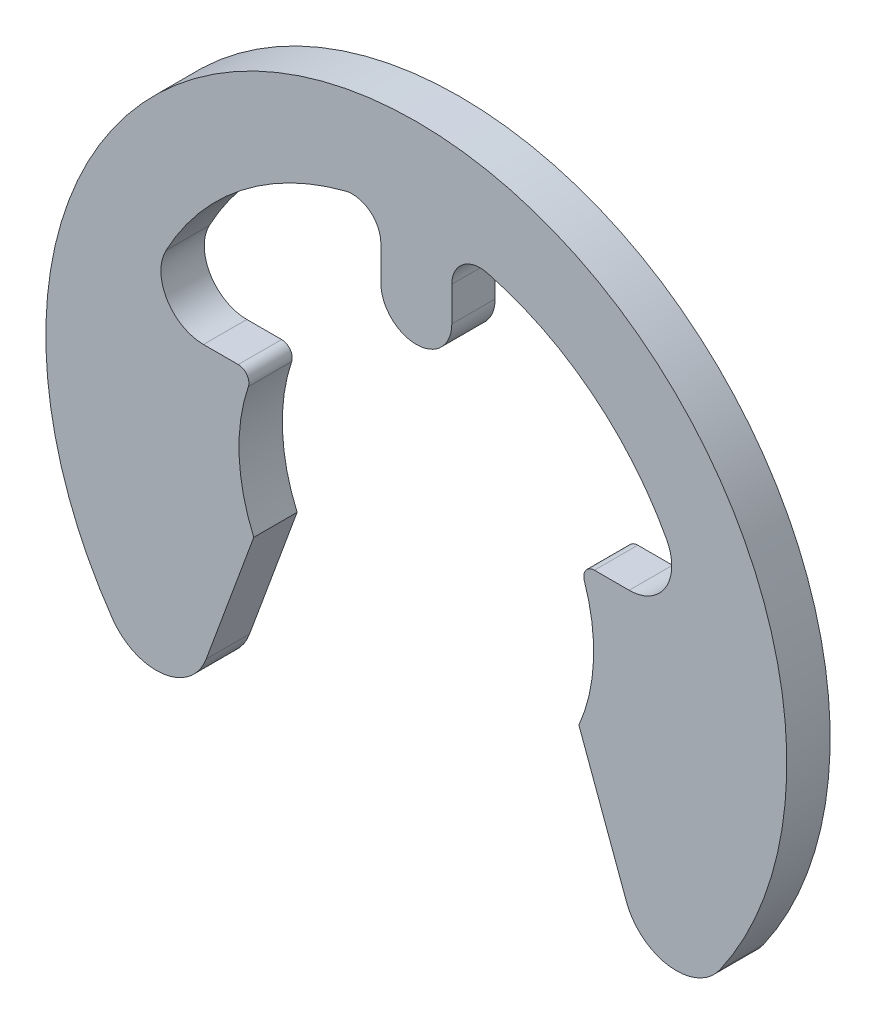
ISO-10303-21;
HEADER;
FILE_DESCRIPTION(('STEP AP214'),'2;1');
FILE_NAME('part.step','',(''),(''),'','','');
FILE_SCHEMA(('AUTOMOTIVE_DESIGN { 1 0 10303 214 1 1 1 1 }'));
ENDSEC;
DATA;
#1=APPLICATION_CONTEXT('core data for automotive mechanical design processes');
#2=APPLICATION_PROTOCOL_DEFINITION('international standard','automotive_design',2000,#1);
#3=PRODUCT_CONTEXT('',#1,'mechanical');
#4=PRODUCT('Part','Part','',(#3));
#5=PRODUCT_RELATED_PRODUCT_CATEGORY('part','',(#4));
#6=PRODUCT_DEFINITION_FORMATION('','',#4);
#7=PRODUCT_DEFINITION_CONTEXT('part definition',#1,'design');
#8=PRODUCT_DEFINITION('design','',#6,#7);
#9=PRODUCT_DEFINITION_SHAPE('','',#8);
#10=(LENGTH_UNIT() NAMED_UNIT(*) SI_UNIT(.MILLI.,.METRE.));
#11=(NAMED_UNIT(*) PLANE_ANGLE_UNIT() SI_UNIT($,.RADIAN.));
#12=(NAMED_UNIT(*) SI_UNIT($,.STERADIAN.) SOLID_ANGLE_UNIT());
#13=UNCERTAINTY_MEASURE_WITH_UNIT(LENGTH_MEASURE(1.E-05),#10,'distance_accuracy_value','');
#14=(GEOMETRIC_REPRESENTATION_CONTEXT(3) GLOBAL_UNCERTAINTY_ASSIGNED_CONTEXT((#13)) GLOBAL_UNIT_ASSIGNED_CONTEXT((#10,
#11,#12)) REPRESENTATION_CONTEXT('',''));
#15=CARTESIAN_POINT('',(0.,0.,0.));
#16=DIRECTION('',(0.,0.,1.));
#17=DIRECTION('',(1.,0.,0.));
#18=AXIS2_PLACEMENT_3D('',#15,#16,#17);
#19=CARTESIAN_POINT('',(0.,-3.64386104623646,0.));
#20=DIRECTION('',(0.,0.,1.));
#21=DIRECTION('',(1.,0.,0.));
#22=AXIS2_PLACEMENT_3D('',#19,#20,#21);
#23=PLANE('',#22);
#24=CARTESIAN_POINT('',(6.59824474187613,-10.587823157175,0.));
#25=DIRECTION('',(0.,0.,1.));
#26=DIRECTION('',(1.,0.,0.));
#27=AXIS2_PLACEMENT_3D('',#24,#25,#26);
#28=CIRCLE('',#27,1.35);
#29=CARTESIAN_POINT('',(5.33140825168701,-11.0543264338251,0.));
#30=VERTEX_POINT('',#29);
#31=CARTESIAN_POINT('',(7.70478267995474,-11.3611754647249,0.));
#32=VERTEX_POINT('',#31);
#33=EDGE_CURVE('E156',#30,#32,#28,.T.);
#34=ORIENTED_EDGE('',*,*,#33,.F.);
#35=DIRECTION('',(0.345557982703799,-0.93839740014009,0.));
#36=VECTOR('',#35,1.);
#37=CARTESIAN_POINT('',(5.33140825168701,-11.0543264338251,0.));
#38=LINE('',#37,#36);
#39=CARTESIAN_POINT('',(4.12431812546025,-7.776351989933,0.));
#40=VERTEX_POINT('',#39);
#41=EDGE_CURVE('E171',#40,#30,#38,.T.);
#42=ORIENTED_EDGE('',*,*,#41,.F.);
#43=CARTESIAN_POINT('',(0.,-5.976351989933,0.));
#44=DIRECTION('',(0.,0.,1.));
#45=DIRECTION('',(1.,0.,0.));
#46=AXIS2_PLACEMENT_3D('',#43,#44,#45);
#47=CIRCLE('',#46,4.5);
#48=CARTESIAN_POINT('',(4.26223032385284,-4.53295576351791,0.));
#49=VERTEX_POINT('',#48);
#50=EDGE_CURVE('E176',#49,#40,#47,.F.);
#51=ORIENTED_EDGE('',*,*,#50,.F.);
#52=CARTESIAN_POINT('',(4.51796414328401,-4.446351989933,0.));
#53=DIRECTION('',(0.,0.,1.));
#54=DIRECTION('',(1.,0.,0.));
#55=AXIS2_PLACEMENT_3D('',#52,#53,#54);
#56=CIRCLE('',#55,0.27);
#57=CARTESIAN_POINT('',(4.51796414328401,-4.176351989933,0.));
#58=VERTEX_POINT('',#57);
#59=EDGE_CURVE('E180',#58,#49,#56,.T.);
#60=ORIENTED_EDGE('',*,*,#59,.F.);
#61=DIRECTION('',(1.,0.,0.));
#62=VECTOR('',#61,1.);
#63=CARTESIAN_POINT('',(4.51796414328401,-4.176351989933,0.));
#64=LINE('',#63,#62);
#65=CARTESIAN_POINT('',(5.4,-4.176351989933,0.));
#66=VERTEX_POINT('',#65);
#67=EDGE_CURVE('E223',#66,#58,#64,.F.);
#68=ORIENTED_EDGE('',*,*,#67,.F.);
#69=CARTESIAN_POINT('',(5.4,-3.096351989933,0.));
#70=DIRECTION('',(0.,0.,1.));
#71=DIRECTION('',(1.,0.,0.));
#72=AXIS2_PLACEMENT_3D('',#69,#70,#71);
#73=CIRCLE('',#72,1.08);
#74=CARTESIAN_POINT('',(6.35294117647059,-2.58811669581535,0.));
#75=VERTEX_POINT('',#74);
#76=EDGE_CURVE('E183',#75,#66,#73,.F.);
#77=ORIENTED_EDGE('',*,*,#76,.F.);
#78=CARTESIAN_POINT('',(0.,-5.976351989933,0.));
#79=DIRECTION('',(0.,0.,1.));
#80=DIRECTION('',(1.,0.,0.));
#81=AXIS2_PLACEMENT_3D('',#78,#79,#80);
#82=CIRCLE('',#81,7.2);
#83=CARTESIAN_POINT('',(1.8,0.99501803324035,0.));
#84=VERTEX_POINT('',#83);
#85=EDGE_CURVE('E187',#84,#75,#82,.F.);
#86=ORIENTED_EDGE('',*,*,#85,.F.);
#87=CARTESIAN_POINT('',(1.62,0.297881030923014,0.));
#88=DIRECTION('',(0.,0.,1.));
#89=DIRECTION('',(1.,0.,0.));
#90=AXIS2_PLACEMENT_3D('',#87,#88,#89);
#91=CIRCLE('',#90,0.72);
#92=CARTESIAN_POINT('',(0.9,0.297881030923015,0.));
#93=VERTEX_POINT('',#92);
#94=EDGE_CURVE('E190',#93,#84,#91,.F.);
#95=ORIENTED_EDGE('',*,*,#94,.F.);
#96=DIRECTION('',(0.,1.,0.));
#97=VECTOR('',#96,1.);
#98=CARTESIAN_POINT('',(0.9,0.297881030923015,0.));
#99=LINE('',#98,#97);
#100=CARTESIAN_POINT('',(0.9,-0.576351989933002,0.));
#101=VERTEX_POINT('',#100);
#102=EDGE_CURVE('E225',#101,#93,#99,.T.);
#103=ORIENTED_EDGE('',*,*,#102,.F.);
#104=CARTESIAN_POINT('',(0.,-0.576351989933002,0.));
#105=DIRECTION('',(0.,0.,1.));
#106=DIRECTION('',(1.,0.,0.));
#107=AXIS2_PLACEMENT_3D('',#104,#105,#106);
#108=CIRCLE('',#107,0.9);
#109=CARTESIAN_POINT('',(-0.9,-0.576351989933002,0.));
#110=VERTEX_POINT('',#109);
#111=EDGE_CURVE('E193',#110,#101,#108,.T.);
#112=ORIENTED_EDGE('',*,*,#111,.F.);
#113=DIRECTION('',(0.,-1.,0.));
#114=VECTOR('',#113,1.);
#115=CARTESIAN_POINT('',(-0.9,-0.576351989933002,0.));
#116=LINE('',#115,#114);
#117=CARTESIAN_POINT('',(-0.9,0.297881030923015,0.));
#118=VERTEX_POINT('',#117);
#119=EDGE_CURVE('E227',#118,#110,#116,.T.);
#120=ORIENTED_EDGE('',*,*,#119,.F.);
#121=CARTESIAN_POINT('',(-1.62,0.297881030923014,0.));
#122=DIRECTION('',(0.,0.,1.));
#123=DIRECTION('',(1.,0.,0.));
#124=AXIS2_PLACEMENT_3D('',#121,#122,#123);
#125=CIRCLE('',#124,0.72);
#126=CARTESIAN_POINT('',(-1.8,0.99501803324035,0.));
#127=VERTEX_POINT('',#126);
#128=EDGE_CURVE('E197',#127,#118,#125,.F.);
#129=ORIENTED_EDGE('',*,*,#128,.F.);
#130=CARTESIAN_POINT('',(0.,-5.976351989933,0.));
#131=DIRECTION('',(0.,0.,1.));
#132=DIRECTION('',(1.,0.,0.));
#133=AXIS2_PLACEMENT_3D('',#130,#131,#132);
#134=CIRCLE('',#133,7.2);
#135=CARTESIAN_POINT('',(-6.35294117647059,-2.58811669581535,0.));
#136=VERTEX_POINT('',#135);
#137=EDGE_CURVE('E201',#136,#127,#134,.F.);
#138=ORIENTED_EDGE('',*,*,#137,.F.);
#139=CARTESIAN_POINT('',(-5.4,-3.096351989933,0.));
#140=DIRECTION('',(0.,0.,1.));
#141=DIRECTION('',(1.,0.,0.));
#142=AXIS2_PLACEMENT_3D('',#139,#140,#141);
#143=CIRCLE('',#142,1.08);
#144=CARTESIAN_POINT('',(-5.4,-4.176351989933,0.));
#145=VERTEX_POINT('',#144);
#146=EDGE_CURVE('E204',#145,#136,#143,.F.);
#147=ORIENTED_EDGE('',*,*,#146,.F.);
#148=DIRECTION('',(1.,0.,0.));
#149=VECTOR('',#148,1.);
#150=CARTESIAN_POINT('',(-5.4,-4.176351989933,0.));
#151=LINE('',#150,#149);
#152=CARTESIAN_POINT('',(-4.51796414328401,-4.176351989933,0.));
#153=VERTEX_POINT('',#152);
#154=EDGE_CURVE('E229',#153,#145,#151,.F.);
#155=ORIENTED_EDGE('',*,*,#154,.F.);
#156=CARTESIAN_POINT('',(-4.51796414328401,-4.446351989933,0.));
#157=DIRECTION('',(0.,0.,1.));
#158=DIRECTION('',(1.,0.,0.));
#159=AXIS2_PLACEMENT_3D('',#156,#157,#158);
#160=CIRCLE('',#159,0.27);
#161=CARTESIAN_POINT('',(-4.26223032385284,-4.53295576351791,0.));
#162=VERTEX_POINT('',#161);
#163=EDGE_CURVE('E207',#162,#153,#160,.T.);
#164=ORIENTED_EDGE('',*,*,#163,.F.);
#165=CARTESIAN_POINT('',(0.,-5.976351989933,0.));
#166=DIRECTION('',(0.,0.,1.));
#167=DIRECTION('',(1.,0.,0.));
#168=AXIS2_PLACEMENT_3D('',#165,#166,#167);
#169=CIRCLE('',#168,4.5);
#170=CARTESIAN_POINT('',(-4.12431812546025,-7.776351989933,0.));
#171=VERTEX_POINT('',#170);
#172=EDGE_CURVE('E211',#171,#162,#169,.F.);
#173=ORIENTED_EDGE('',*,*,#172,.F.);
#174=DIRECTION('',(0.345557982703799,0.93839740014009,0.));
#175=VECTOR('',#174,1.);
#176=CARTESIAN_POINT('',(-4.12431812546025,-7.776351989933,0.));
#177=LINE('',#176,#175);
#178=CARTESIAN_POINT('',(-5.33140825168701,-11.0543264338251,0.));
#179=VERTEX_POINT('',#178);
#180=EDGE_CURVE('E216',#179,#171,#177,.T.);
#181=ORIENTED_EDGE('',*,*,#180,.F.);
#182=CARTESIAN_POINT('',(-6.59824474187613,-10.587823157175,0.));
#183=DIRECTION('',(0.,0.,1.));
#184=DIRECTION('',(1.,0.,0.));
#185=AXIS2_PLACEMENT_3D('',#182,#183,#184);
#186=CIRCLE('',#185,1.35);
#187=CARTESIAN_POINT('',(-7.70478267995473,-11.3611754647249,0.));
#188=VERTEX_POINT('',#187);
#189=EDGE_CURVE('E158',#188,#179,#186,.T.);
#190=ORIENTED_EDGE('',*,*,#189,.F.);
#191=CARTESIAN_POINT('',(0.,-5.976351989933,0.));
#192=DIRECTION('',(0.,0.,1.));
#193=DIRECTION('',(1.,0.,0.));
#194=AXIS2_PLACEMENT_3D('',#191,#192,#193);
#195=CIRCLE('',#194,9.4);
#196=EDGE_CURVE('E21',#32,#188,#195,.T.);
#197=ORIENTED_EDGE('',*,*,#196,.F.);
#198=EDGE_LOOP('',(#34,#42,#51,#60,#68,#77,#86,#95,#103,#112,#120,#129,#138,#147,#155,#164,#173,
#181,#190,#197));
#199=FACE_BOUND('',#198,.T.);
#200=ADVANCED_FACE('F17',(#199),#23,.F.);
#201=CARTESIAN_POINT('',(0.,-5.976351989933,0.));
#202=DIRECTION('',(0.,0.,1.));
#203=DIRECTION('',(1.,0.,0.));
#204=AXIS2_PLACEMENT_3D('',#201,#202,#203);
#205=CYLINDRICAL_SURFACE('',#204,9.4);
#206=ORIENTED_EDGE('',*,*,#196,.T.);
#207=DIRECTION('',(0.,0.,1.));
#208=VECTOR('',#207,1.);
#209=CARTESIAN_POINT('',(-7.70478267995474,-11.3611754647249,0.));
#210=LINE('',#209,#208);
#211=CARTESIAN_POINT('',(-7.70478267995473,-11.3611754647249,1.1));
#212=VERTEX_POINT('',#211);
#213=EDGE_CURVE('E161',#212,#188,#210,.F.);
#214=ORIENTED_EDGE('',*,*,#213,.F.);
#215=CARTESIAN_POINT('',(0.,-5.976351989933,1.1));
#216=DIRECTION('',(0.,0.,1.));
#217=DIRECTION('',(1.,0.,0.));
#218=AXIS2_PLACEMENT_3D('',#215,#216,#217);
#219=CIRCLE('',#218,9.4);
#220=CARTESIAN_POINT('',(7.70478267995474,-11.3611754647249,1.1));
#221=VERTEX_POINT('',#220);
#222=EDGE_CURVE('E166',#221,#212,#219,.T.);
#223=ORIENTED_EDGE('',*,*,#222,.F.);
#224=DIRECTION('',(0.,0.,1.));
#225=VECTOR('',#224,1.);
#226=CARTESIAN_POINT('',(7.70478267995473,-11.3611754647249,0.));
#227=LINE('',#226,#225);
#228=EDGE_CURVE('E163',#32,#221,#227,.T.);
#229=ORIENTED_EDGE('',*,*,#228,.F.);
#230=EDGE_LOOP('',(#206,#214,#223,#229));
#231=FACE_BOUND('',#230,.T.);
#232=ADVANCED_FACE('F164',(#231),#205,.T.);
#233=CARTESIAN_POINT('',(-6.59824474187613,-10.587823157175,0.));
#234=DIRECTION('',(0.,0.,1.));
#235=DIRECTION('',(1.,0.,0.));
#236=AXIS2_PLACEMENT_3D('',#233,#234,#235);
#237=CYLINDRICAL_SURFACE('',#236,1.35);
#238=ORIENTED_EDGE('',*,*,#189,.T.);
#239=DIRECTION('',(0.,0.,1.));
#240=VECTOR('',#239,1.);
#241=CARTESIAN_POINT('',(-5.33140825168701,-11.0543264338251,0.));
#242=LINE('',#241,#240);
#243=CARTESIAN_POINT('',(-5.33140825168701,-11.0543264338251,1.1));
#244=VERTEX_POINT('',#243);
#245=EDGE_CURVE('E213',#244,#179,#242,.F.);
#246=ORIENTED_EDGE('',*,*,#245,.F.);
#247=CARTESIAN_POINT('',(-6.59824474187613,-10.587823157175,1.1));
#248=DIRECTION('',(0.,0.,1.));
#249=DIRECTION('',(1.,0.,0.));
#250=AXIS2_PLACEMENT_3D('',#247,#248,#249);
#251=CIRCLE('',#250,1.35);
#252=EDGE_CURVE('E269',#212,#244,#251,.T.);
#253=ORIENTED_EDGE('',*,*,#252,.F.);
#254=ORIENTED_EDGE('',*,*,#213,.T.);
#255=EDGE_LOOP('',(#238,#246,#253,#254));
#256=FACE_BOUND('',#255,.T.);
#257=ADVANCED_FACE('F530',(#256),#237,.T.);
#258=CARTESIAN_POINT('',(-4.12431812546025,-7.776351989933,0.));
#259=DIRECTION('',(0.93839740014009,-0.345557982703799,0.));
#260=DIRECTION('',(0.345557982703799,0.93839740014009,0.));
#261=AXIS2_PLACEMENT_3D('',#258,#259,#260);
#262=PLANE('',#261);
#263=ORIENTED_EDGE('',*,*,#180,.T.);
#264=DIRECTION('',(0.,0.,1.));
#265=VECTOR('',#264,1.);
#266=CARTESIAN_POINT('',(-4.12431812546025,-7.776351989933,0.));
#267=LINE('',#266,#265);
#268=CARTESIAN_POINT('',(-4.12431812546025,-7.776351989933,1.1));
#269=VERTEX_POINT('',#268);
#270=EDGE_CURVE('E212',#269,#171,#267,.F.);
#271=ORIENTED_EDGE('',*,*,#270,.F.);
#272=DIRECTION('',(0.345557982703799,0.93839740014009,0.));
#273=VECTOR('',#272,1.);
#274=CARTESIAN_POINT('',(-5.33140825168701,-11.0543264338251,1.1));
#275=LINE('',#274,#273);
#276=EDGE_CURVE('E268',#244,#269,#275,.T.);
#277=ORIENTED_EDGE('',*,*,#276,.F.);
#278=ORIENTED_EDGE('',*,*,#245,.T.);
#279=EDGE_LOOP('',(#263,#271,#277,#278));
#280=FACE_BOUND('',#279,.T.);
#281=ADVANCED_FACE('F323',(#280),#262,.T.);
#282=CARTESIAN_POINT('',(0.,-5.976351989933,0.));
#283=DIRECTION('',(0.,0.,1.));
#284=DIRECTION('',(1.,0.,0.));
#285=AXIS2_PLACEMENT_3D('',#282,#283,#284);
#286=CYLINDRICAL_SURFACE('',#285,4.5);
#287=ORIENTED_EDGE('',*,*,#172,.T.);
#288=DIRECTION('',(0.,0.,1.));
#289=VECTOR('',#288,1.);
#290=CARTESIAN_POINT('',(-4.26223032385284,-4.53295576351791,0.));
#291=LINE('',#290,#289);
#292=CARTESIAN_POINT('',(-4.26223032385284,-4.53295576351791,1.1));
#293=VERTEX_POINT('',#292);
#294=EDGE_CURVE('E210',#293,#162,#291,.F.);
#295=ORIENTED_EDGE('',*,*,#294,.F.);
#296=CARTESIAN_POINT('',(0.,-5.976351989933,1.1));
#297=DIRECTION('',(0.,0.,1.));
#298=DIRECTION('',(1.,0.,0.));
#299=AXIS2_PLACEMENT_3D('',#296,#297,#298);
#300=CIRCLE('',#299,4.5);
#301=EDGE_CURVE('E266',#269,#293,#300,.F.);
#302=ORIENTED_EDGE('',*,*,#301,.F.);
#303=ORIENTED_EDGE('',*,*,#270,.T.);
#304=EDGE_LOOP('',(#287,#295,#302,#303));
#305=FACE_BOUND('',#304,.T.);
#306=ADVANCED_FACE('F318',(#305),#286,.F.);
#307=CARTESIAN_POINT('',(-4.51796414328401,-4.446351989933,0.));
#308=DIRECTION('',(0.,0.,1.));
#309=DIRECTION('',(1.,0.,0.));
#310=AXIS2_PLACEMENT_3D('',#307,#308,#309);
#311=CYLINDRICAL_SURFACE('',#310,0.27);
#312=ORIENTED_EDGE('',*,*,#163,.T.);
#313=DIRECTION('',(0.,0.,1.));
#314=VECTOR('',#313,1.);
#315=CARTESIAN_POINT('',(-4.51796414328401,-4.176351989933,0.));
#316=LINE('',#315,#314);
#317=CARTESIAN_POINT('',(-4.51796414328401,-4.176351989933,1.1));
#318=VERTEX_POINT('',#317);
#319=EDGE_CURVE('E209',#318,#153,#316,.F.);
#320=ORIENTED_EDGE('',*,*,#319,.F.);
#321=CARTESIAN_POINT('',(-4.51796414328401,-4.446351989933,1.1));
#322=DIRECTION('',(0.,0.,1.));
#323=DIRECTION('',(1.,0.,0.));
#324=AXIS2_PLACEMENT_3D('',#321,#322,#323);
#325=CIRCLE('',#324,0.27);
#326=EDGE_CURVE('E263',#293,#318,#325,.T.);
#327=ORIENTED_EDGE('',*,*,#326,.F.);
#328=ORIENTED_EDGE('',*,*,#294,.T.);
#329=EDGE_LOOP('',(#312,#320,#327,#328));
#330=FACE_BOUND('',#329,.T.);
#331=ADVANCED_FACE('F328',(#330),#311,.T.);
#332=CARTESIAN_POINT('',(-5.4,-4.176351989933,0.));
#333=DIRECTION('',(0.,1.,0.));
#334=DIRECTION('',(0.,0.,1.));
#335=AXIS2_PLACEMENT_3D('',#332,#333,#334);
#336=PLANE('',#335);
#337=ORIENTED_EDGE('',*,*,#154,.T.);
#338=DIRECTION('',(0.,0.,1.));
#339=VECTOR('',#338,1.);
#340=CARTESIAN_POINT('',(-5.4,-4.176351989933,0.));
#341=LINE('',#340,#339);
#342=CARTESIAN_POINT('',(-5.4,-4.176351989933,1.1));
#343=VERTEX_POINT('',#342);
#344=EDGE_CURVE('E206',#343,#145,#341,.F.);
#345=ORIENTED_EDGE('',*,*,#344,.F.);
#346=DIRECTION('',(1.,0.,0.));
#347=VECTOR('',#346,1.);
#348=CARTESIAN_POINT('',(0.,-4.176351989933,1.1));
#349=LINE('',#348,#347);
#350=EDGE_CURVE('E262',#318,#343,#349,.F.);
#351=ORIENTED_EDGE('',*,*,#350,.F.);
#352=ORIENTED_EDGE('',*,*,#319,.T.);
#353=EDGE_LOOP('',(#337,#345,#351,#352));
#354=FACE_BOUND('',#353,.T.);
#355=ADVANCED_FACE('F332',(#354),#336,.T.);
#356=CARTESIAN_POINT('',(-5.4,-3.096351989933,0.));
#357=DIRECTION('',(0.,0.,1.));
#358=DIRECTION('',(1.,0.,0.));
#359=AXIS2_PLACEMENT_3D('',#356,#357,#358);
#360=CYLINDRICAL_SURFACE('',#359,1.08);
#361=ORIENTED_EDGE('',*,*,#146,.T.);
#362=DIRECTION('',(0.,0.,1.));
#363=VECTOR('',#362,1.);
#364=CARTESIAN_POINT('',(-6.35294117647059,-2.58811669581535,0.));
#365=LINE('',#364,#363);
#366=CARTESIAN_POINT('',(-6.35294117647059,-2.58811669581535,1.1));
#367=VERTEX_POINT('',#366);
#368=EDGE_CURVE('E203',#367,#136,#365,.F.);
#369=ORIENTED_EDGE('',*,*,#368,.F.);
#370=CARTESIAN_POINT('',(-5.4,-3.096351989933,1.1));
#371=DIRECTION('',(0.,0.,1.));
#372=DIRECTION('',(1.,0.,0.));
#373=AXIS2_PLACEMENT_3D('',#370,#371,#372);
#374=CIRCLE('',#373,1.08);
#375=EDGE_CURVE('E259',#343,#367,#374,.F.);
#376=ORIENTED_EDGE('',*,*,#375,.F.);
#377=ORIENTED_EDGE('',*,*,#344,.T.);
#378=EDGE_LOOP('',(#361,#369,#376,#377));
#379=FACE_BOUND('',#378,.T.);
#380=ADVANCED_FACE('F334',(#379),#360,.F.);
#381=CARTESIAN_POINT('',(0.,-5.976351989933,0.));
#382=DIRECTION('',(0.,0.,1.));
#383=DIRECTION('',(1.,0.,0.));
#384=AXIS2_PLACEMENT_3D('',#381,#382,#383);
#385=CYLINDRICAL_SURFACE('',#384,7.2);
#386=ORIENTED_EDGE('',*,*,#137,.T.);
#387=DIRECTION('',(0.,0.,1.));
#388=VECTOR('',#387,1.);
#389=CARTESIAN_POINT('',(-1.8,0.99501803324035,0.));
#390=LINE('',#389,#388);
#391=CARTESIAN_POINT('',(-1.8,0.99501803324035,1.1));
#392=VERTEX_POINT('',#391);
#393=EDGE_CURVE('E200',#392,#127,#390,.F.);
#394=ORIENTED_EDGE('',*,*,#393,.F.);
#395=CARTESIAN_POINT('',(0.,-5.976351989933,1.1));
#396=DIRECTION('',(0.,0.,1.));
#397=DIRECTION('',(1.,0.,0.));
#398=AXIS2_PLACEMENT_3D('',#395,#396,#397);
#399=CIRCLE('',#398,7.2);
#400=EDGE_CURVE('E256',#367,#392,#399,.F.);
#401=ORIENTED_EDGE('',*,*,#400,.F.);
#402=ORIENTED_EDGE('',*,*,#368,.T.);
#403=EDGE_LOOP('',(#386,#394,#401,#402));
#404=FACE_BOUND('',#403,.T.);
#405=ADVANCED_FACE('F338',(#404),#385,.F.);
#406=CARTESIAN_POINT('',(-1.62,0.297881030923014,0.));
#407=DIRECTION('',(0.,0.,1.));
#408=DIRECTION('',(1.,0.,0.));
#409=AXIS2_PLACEMENT_3D('',#406,#407,#408);
#410=CYLINDRICAL_SURFACE('',#409,0.72);
#411=ORIENTED_EDGE('',*,*,#128,.T.);
#412=DIRECTION('',(0.,0.,1.));
#413=VECTOR('',#412,1.);
#414=CARTESIAN_POINT('',(-0.9,0.297881030923015,0.));
#415=LINE('',#414,#413);
#416=CARTESIAN_POINT('',(-0.9,0.297881030923015,1.1));
#417=VERTEX_POINT('',#416);
#418=EDGE_CURVE('E199',#417,#118,#415,.F.);
#419=ORIENTED_EDGE('',*,*,#418,.F.);
#420=CARTESIAN_POINT('',(-1.62,0.297881030923014,1.1));
#421=DIRECTION('',(0.,0.,1.));
#422=DIRECTION('',(1.,0.,0.));
#423=AXIS2_PLACEMENT_3D('',#420,#421,#422);
#424=CIRCLE('',#423,0.72);
#425=EDGE_CURVE('E253',#392,#417,#424,.F.);
#426=ORIENTED_EDGE('',*,*,#425,.F.);
#427=ORIENTED_EDGE('',*,*,#393,.T.);
#428=EDGE_LOOP('',(#411,#419,#426,#427));
#429=FACE_BOUND('',#428,.T.);
#430=ADVANCED_FACE('F342',(#429),#410,.F.);
#431=CARTESIAN_POINT('',(-0.9,-0.576351989933002,0.));
#432=DIRECTION('',(-1.,0.,0.));
#433=DIRECTION('',(0.,-1.,0.));
#434=AXIS2_PLACEMENT_3D('',#431,#432,#433);
#435=PLANE('',#434);
#436=ORIENTED_EDGE('',*,*,#119,.T.);
#437=DIRECTION('',(0.,0.,1.));
#438=VECTOR('',#437,1.);
#439=CARTESIAN_POINT('',(-0.9,-0.576351989933002,0.));
#440=LINE('',#439,#438);
#441=CARTESIAN_POINT('',(-0.9,-0.576351989933002,1.1));
#442=VERTEX_POINT('',#441);
#443=EDGE_CURVE('E196',#442,#110,#440,.F.);
#444=ORIENTED_EDGE('',*,*,#443,.F.);
#445=DIRECTION('',(0.,1.,0.));
#446=VECTOR('',#445,1.);
#447=CARTESIAN_POINT('',(-0.9,-3.64386104623646,1.1));
#448=LINE('',#447,#446);
#449=EDGE_CURVE('E252',#417,#442,#448,.F.);
#450=ORIENTED_EDGE('',*,*,#449,.F.);
#451=ORIENTED_EDGE('',*,*,#418,.T.);
#452=EDGE_LOOP('',(#436,#444,#450,#451));
#453=FACE_BOUND('',#452,.T.);
#454=ADVANCED_FACE('F346',(#453),#435,.T.);
#455=CARTESIAN_POINT('',(0.,-0.576351989933002,0.));
#456=DIRECTION('',(0.,0.,1.));
#457=DIRECTION('',(1.,0.,0.));
#458=AXIS2_PLACEMENT_3D('',#455,#456,#457);
#459=CYLINDRICAL_SURFACE('',#458,0.9);
#460=ORIENTED_EDGE('',*,*,#111,.T.);
#461=DIRECTION('',(0.,0.,1.));
#462=VECTOR('',#461,1.);
#463=CARTESIAN_POINT('',(0.9,-0.576351989933002,0.));
#464=LINE('',#463,#462);
#465=CARTESIAN_POINT('',(0.9,-0.576351989933002,1.1));
#466=VERTEX_POINT('',#465);
#467=EDGE_CURVE('E195',#466,#101,#464,.F.);
#468=ORIENTED_EDGE('',*,*,#467,.F.);
#469=CARTESIAN_POINT('',(0.,-0.576351989933002,1.1));
#470=DIRECTION('',(0.,0.,1.));
#471=DIRECTION('',(1.,0.,0.));
#472=AXIS2_PLACEMENT_3D('',#469,#470,#471);
#473=CIRCLE('',#472,0.9);
#474=EDGE_CURVE('E249',#442,#466,#473,.T.);
#475=ORIENTED_EDGE('',*,*,#474,.F.);
#476=ORIENTED_EDGE('',*,*,#443,.T.);
#477=EDGE_LOOP('',(#460,#468,#475,#476));
#478=FACE_BOUND('',#477,.T.);
#479=ADVANCED_FACE('F350',(#478),#459,.T.);
#480=CARTESIAN_POINT('',(0.9,0.297881030923015,0.));
#481=DIRECTION('',(1.,0.,0.));
#482=DIRECTION('',(0.,1.,0.));
#483=AXIS2_PLACEMENT_3D('',#480,#481,#482);
#484=PLANE('',#483);
#485=ORIENTED_EDGE('',*,*,#102,.T.);
#486=DIRECTION('',(0.,0.,1.));
#487=VECTOR('',#486,1.);
#488=CARTESIAN_POINT('',(0.9,0.297881030923015,0.));
#489=LINE('',#488,#487);
#490=CARTESIAN_POINT('',(0.9,0.297881030923015,1.1));
#491=VERTEX_POINT('',#490);
#492=EDGE_CURVE('E192',#491,#93,#489,.F.);
#493=ORIENTED_EDGE('',*,*,#492,.F.);
#494=DIRECTION('',(0.,1.,0.));
#495=VECTOR('',#494,1.);
#496=CARTESIAN_POINT('',(0.9,-3.64386104623646,1.1));
#497=LINE('',#496,#495);
#498=EDGE_CURVE('E248',#466,#491,#497,.T.);
#499=ORIENTED_EDGE('',*,*,#498,.F.);
#500=ORIENTED_EDGE('',*,*,#467,.T.);
#501=EDGE_LOOP('',(#485,#493,#499,#500));
#502=FACE_BOUND('',#501,.T.);
#503=ADVANCED_FACE('F354',(#502),#484,.T.);
#504=CARTESIAN_POINT('',(1.62,0.297881030923014,0.));
#505=DIRECTION('',(0.,0.,1.));
#506=DIRECTION('',(1.,0.,0.));
#507=AXIS2_PLACEMENT_3D('',#504,#505,#506);
#508=CYLINDRICAL_SURFACE('',#507,0.72);
#509=ORIENTED_EDGE('',*,*,#94,.T.);
#510=DIRECTION('',(0.,0.,1.));
#511=VECTOR('',#510,1.);
#512=CARTESIAN_POINT('',(1.8,0.99501803324035,0.));
#513=LINE('',#512,#511);
#514=CARTESIAN_POINT('',(1.8,0.99501803324035,1.1));
#515=VERTEX_POINT('',#514);
#516=EDGE_CURVE('E189',#515,#84,#513,.F.);
#517=ORIENTED_EDGE('',*,*,#516,.F.);
#518=CARTESIAN_POINT('',(1.62,0.297881030923014,1.1));
#519=DIRECTION('',(0.,0.,1.));
#520=DIRECTION('',(1.,0.,0.));
#521=AXIS2_PLACEMENT_3D('',#518,#519,#520);
#522=CIRCLE('',#521,0.72);
#523=EDGE_CURVE('E245',#491,#515,#522,.F.);
#524=ORIENTED_EDGE('',*,*,#523,.F.);
#525=ORIENTED_EDGE('',*,*,#492,.T.);
#526=EDGE_LOOP('',(#509,#517,#524,#525));
#527=FACE_BOUND('',#526,.T.);
#528=ADVANCED_FACE('F358',(#527),#508,.F.);
#529=CARTESIAN_POINT('',(0.,-5.976351989933,0.));
#530=DIRECTION('',(0.,0.,1.));
#531=DIRECTION('',(1.,0.,0.));
#532=AXIS2_PLACEMENT_3D('',#529,#530,#531);
#533=CYLINDRICAL_SURFACE('',#532,7.2);
#534=ORIENTED_EDGE('',*,*,#85,.T.);
#535=DIRECTION('',(0.,0.,1.));
#536=VECTOR('',#535,1.);
#537=CARTESIAN_POINT('',(6.35294117647059,-2.58811669581535,0.));
#538=LINE('',#537,#536);
#539=CARTESIAN_POINT('',(6.35294117647059,-2.58811669581535,1.1));
#540=VERTEX_POINT('',#539);
#541=EDGE_CURVE('E186',#540,#75,#538,.F.);
#542=ORIENTED_EDGE('',*,*,#541,.F.);
#543=CARTESIAN_POINT('',(0.,-5.976351989933,1.1));
#544=DIRECTION('',(0.,0.,1.));
#545=DIRECTION('',(1.,0.,0.));
#546=AXIS2_PLACEMENT_3D('',#543,#544,#545);
#547=CIRCLE('',#546,7.2);
#548=EDGE_CURVE('E242',#515,#540,#547,.F.);
#549=ORIENTED_EDGE('',*,*,#548,.F.);
#550=ORIENTED_EDGE('',*,*,#516,.T.);
#551=EDGE_LOOP('',(#534,#542,#549,#550));
#552=FACE_BOUND('',#551,.T.);
#553=ADVANCED_FACE('F362',(#552),#533,.F.);
#554=CARTESIAN_POINT('',(5.4,-3.096351989933,0.));
#555=DIRECTION('',(0.,0.,1.));
#556=DIRECTION('',(1.,0.,0.));
#557=AXIS2_PLACEMENT_3D('',#554,#555,#556);
#558=CYLINDRICAL_SURFACE('',#557,1.08);
#559=ORIENTED_EDGE('',*,*,#76,.T.);
#560=DIRECTION('',(0.,0.,1.));
#561=VECTOR('',#560,1.);
#562=CARTESIAN_POINT('',(5.4,-4.176351989933,0.));
#563=LINE('',#562,#561);
#564=CARTESIAN_POINT('',(5.4,-4.176351989933,1.1));
#565=VERTEX_POINT('',#564);
#566=EDGE_CURVE('E185',#565,#66,#563,.F.);
#567=ORIENTED_EDGE('',*,*,#566,.F.);
#568=CARTESIAN_POINT('',(5.4,-3.096351989933,1.1));
#569=DIRECTION('',(0.,0.,1.));
#570=DIRECTION('',(1.,0.,0.));
#571=AXIS2_PLACEMENT_3D('',#568,#569,#570);
#572=CIRCLE('',#571,1.08);
#573=EDGE_CURVE('E239',#540,#565,#572,.F.);
#574=ORIENTED_EDGE('',*,*,#573,.F.);
#575=ORIENTED_EDGE('',*,*,#541,.T.);
#576=EDGE_LOOP('',(#559,#567,#574,#575));
#577=FACE_BOUND('',#576,.T.);
#578=ADVANCED_FACE('F366',(#577),#558,.F.);
#579=CARTESIAN_POINT('',(4.51796414328401,-4.176351989933,0.));
#580=DIRECTION('',(0.,1.,0.));
#581=DIRECTION('',(0.,0.,1.));
#582=AXIS2_PLACEMENT_3D('',#579,#580,#581);
#583=PLANE('',#582);
#584=ORIENTED_EDGE('',*,*,#67,.T.);
#585=DIRECTION('',(0.,0.,1.));
#586=VECTOR('',#585,1.);
#587=CARTESIAN_POINT('',(4.51796414328401,-4.176351989933,0.));
#588=LINE('',#587,#586);
#589=CARTESIAN_POINT('',(4.51796414328401,-4.176351989933,1.1));
#590=VERTEX_POINT('',#589);
#591=EDGE_CURVE('E182',#590,#58,#588,.F.);
#592=ORIENTED_EDGE('',*,*,#591,.F.);
#593=DIRECTION('',(1.,0.,0.));
#594=VECTOR('',#593,1.);
#595=CARTESIAN_POINT('',(0.,-4.176351989933,1.1));
#596=LINE('',#595,#594);
#597=EDGE_CURVE('E238',#565,#590,#596,.F.);
#598=ORIENTED_EDGE('',*,*,#597,.F.);
#599=ORIENTED_EDGE('',*,*,#566,.T.);
#600=EDGE_LOOP('',(#584,#592,#598,#599));
#601=FACE_BOUND('',#600,.T.);
#602=ADVANCED_FACE('F370',(#601),#583,.T.);
#603=CARTESIAN_POINT('',(4.51796414328401,-4.446351989933,0.));
#604=DIRECTION('',(0.,0.,1.));
#605=DIRECTION('',(1.,0.,0.));
#606=AXIS2_PLACEMENT_3D('',#603,#604,#605);
#607=CYLINDRICAL_SURFACE('',#606,0.27);
#608=ORIENTED_EDGE('',*,*,#59,.T.);
#609=DIRECTION('',(0.,0.,1.));
#610=VECTOR('',#609,1.);
#611=CARTESIAN_POINT('',(4.26223032385284,-4.53295576351791,0.));
#612=LINE('',#611,#610);
#613=CARTESIAN_POINT('',(4.26223032385284,-4.53295576351791,1.1));
#614=VERTEX_POINT('',#613);
#615=EDGE_CURVE('E179',#614,#49,#612,.F.);
#616=ORIENTED_EDGE('',*,*,#615,.F.);
#617=CARTESIAN_POINT('',(4.51796414328401,-4.446351989933,1.1));
#618=DIRECTION('',(0.,0.,1.));
#619=DIRECTION('',(1.,0.,0.));
#620=AXIS2_PLACEMENT_3D('',#617,#618,#619);
#621=CIRCLE('',#620,0.27);
#622=EDGE_CURVE('E235',#590,#614,#621,.T.);
#623=ORIENTED_EDGE('',*,*,#622,.F.);
#624=ORIENTED_EDGE('',*,*,#591,.T.);
#625=EDGE_LOOP('',(#608,#616,#623,#624));
#626=FACE_BOUND('',#625,.T.);
#627=ADVANCED_FACE('F374',(#626),#607,.T.);
#628=CARTESIAN_POINT('',(0.,-5.976351989933,0.));
#629=DIRECTION('',(0.,0.,1.));
#630=DIRECTION('',(1.,0.,0.));
#631=AXIS2_PLACEMENT_3D('',#628,#629,#630);
#632=CYLINDRICAL_SURFACE('',#631,4.5);
#633=ORIENTED_EDGE('',*,*,#50,.T.);
#634=DIRECTION('',(0.,0.,1.));
#635=VECTOR('',#634,1.);
#636=CARTESIAN_POINT('',(4.12431812546025,-7.776351989933,0.));
#637=LINE('',#636,#635);
#638=CARTESIAN_POINT('',(4.12431812546025,-7.776351989933,1.1));
#639=VERTEX_POINT('',#638);
#640=EDGE_CURVE('E178',#639,#40,#637,.F.);
#641=ORIENTED_EDGE('',*,*,#640,.F.);
#642=CARTESIAN_POINT('',(0.,-5.976351989933,1.1));
#643=DIRECTION('',(0.,0.,1.));
#644=DIRECTION('',(1.,0.,0.));
#645=AXIS2_PLACEMENT_3D('',#642,#643,#644);
#646=CIRCLE('',#645,4.5);
#647=EDGE_CURVE('E232',#614,#639,#646,.F.);
#648=ORIENTED_EDGE('',*,*,#647,.F.);
#649=ORIENTED_EDGE('',*,*,#615,.T.);
#650=EDGE_LOOP('',(#633,#641,#648,#649));
#651=FACE_BOUND('',#650,.T.);
#652=ADVANCED_FACE('F377',(#651),#632,.F.);
#653=CARTESIAN_POINT('',(5.33140825168701,-11.0543264338251,0.));
#654=DIRECTION('',(-0.93839740014009,-0.345557982703799,0.));
#655=DIRECTION('',(0.345557982703799,-0.93839740014009,0.));
#656=AXIS2_PLACEMENT_3D('',#653,#654,#655);
#657=PLANE('',#656);
#658=ORIENTED_EDGE('',*,*,#41,.T.);
#659=DIRECTION('',(0.,0.,1.));
#660=VECTOR('',#659,1.);
#661=CARTESIAN_POINT('',(5.33140825168701,-11.0543264338251,0.));
#662=LINE('',#661,#660);
#663=CARTESIAN_POINT('',(5.33140825168701,-11.0543264338251,1.1));
#664=VERTEX_POINT('',#663);
#665=EDGE_CURVE('E36',#664,#30,#662,.F.);
#666=ORIENTED_EDGE('',*,*,#665,.F.);
#667=DIRECTION('',(0.345557982703799,-0.93839740014009,0.));
#668=VECTOR('',#667,1.);
#669=CARTESIAN_POINT('',(4.12431812546025,-7.776351989933,1.1));
#670=LINE('',#669,#668);
#671=EDGE_CURVE('E27',#639,#664,#670,.T.);
#672=ORIENTED_EDGE('',*,*,#671,.F.);
#673=ORIENTED_EDGE('',*,*,#640,.T.);
#674=EDGE_LOOP('',(#658,#666,#672,#673));
#675=FACE_BOUND('',#674,.T.);
#676=ADVANCED_FACE('F378',(#675),#657,.T.);
#677=CARTESIAN_POINT('',(6.59824474187613,-10.587823157175,0.));
#678=DIRECTION('',(0.,0.,1.));
#679=DIRECTION('',(1.,0.,0.));
#680=AXIS2_PLACEMENT_3D('',#677,#678,#679);
#681=CYLINDRICAL_SURFACE('',#680,1.35);
#682=ORIENTED_EDGE('',*,*,#33,.T.);
#683=ORIENTED_EDGE('',*,*,#228,.T.);
#684=CARTESIAN_POINT('',(6.59824474187613,-10.587823157175,1.1));
#685=DIRECTION('',(0.,0.,1.));
#686=DIRECTION('',(1.,0.,0.));
#687=AXIS2_PLACEMENT_3D('',#684,#685,#686);
#688=CIRCLE('',#687,1.35);
#689=EDGE_CURVE('E11',#664,#221,#688,.T.);
#690=ORIENTED_EDGE('',*,*,#689,.F.);
#691=ORIENTED_EDGE('',*,*,#665,.T.);
#692=EDGE_LOOP('',(#682,#683,#690,#691));
#693=FACE_BOUND('',#692,.T.);
#694=ADVANCED_FACE('F169',(#693),#681,.T.);
#695=CARTESIAN_POINT('',(0.,-3.64386104623646,1.1));
#696=DIRECTION('',(0.,0.,1.));
#697=DIRECTION('',(1.,0.,0.));
#698=AXIS2_PLACEMENT_3D('',#695,#696,#697);
#699=PLANE('',#698);
#700=ORIENTED_EDGE('',*,*,#671,.T.);
#701=ORIENTED_EDGE('',*,*,#689,.T.);
#702=ORIENTED_EDGE('',*,*,#222,.T.);
#703=ORIENTED_EDGE('',*,*,#252,.T.);
#704=ORIENTED_EDGE('',*,*,#276,.T.);
#705=ORIENTED_EDGE('',*,*,#301,.T.);
#706=ORIENTED_EDGE('',*,*,#326,.T.);
#707=ORIENTED_EDGE('',*,*,#350,.T.);
#708=ORIENTED_EDGE('',*,*,#375,.T.);
#709=ORIENTED_EDGE('',*,*,#400,.T.);
#710=ORIENTED_EDGE('',*,*,#425,.T.);
#711=ORIENTED_EDGE('',*,*,#449,.T.);
#712=ORIENTED_EDGE('',*,*,#474,.T.);
#713=ORIENTED_EDGE('',*,*,#498,.T.);
#714=ORIENTED_EDGE('',*,*,#523,.T.);
#715=ORIENTED_EDGE('',*,*,#548,.T.);
#716=ORIENTED_EDGE('',*,*,#573,.T.);
#717=ORIENTED_EDGE('',*,*,#597,.T.);
#718=ORIENTED_EDGE('',*,*,#622,.T.);
#719=ORIENTED_EDGE('',*,*,#647,.T.);
#720=EDGE_LOOP('',(#700,#701,#702,#703,#704,#705,#706,#707,#708,#709,#710,#711,#712,#713,#714,
#715,#716,#717,#718,#719));
#721=FACE_BOUND('',#720,.T.);
#722=ADVANCED_FACE('F19',(#721),#699,.T.);
#723=CLOSED_SHELL('',(#200,#232,#257,#281,#306,#331,#355,#380,#405,#430,#454,#479,#503,#528,
#553,#578,#602,#627,#652,#676,#694,#722));
#724=MANIFOLD_SOLID_BREP('B1',#723);
#725=ADVANCED_BREP_SHAPE_REPRESENTATION('',(#18,#724),#14);
#726=SHAPE_DEFINITION_REPRESENTATION(#9,#725);
ENDSEC;
END-ISO-10303-21;
